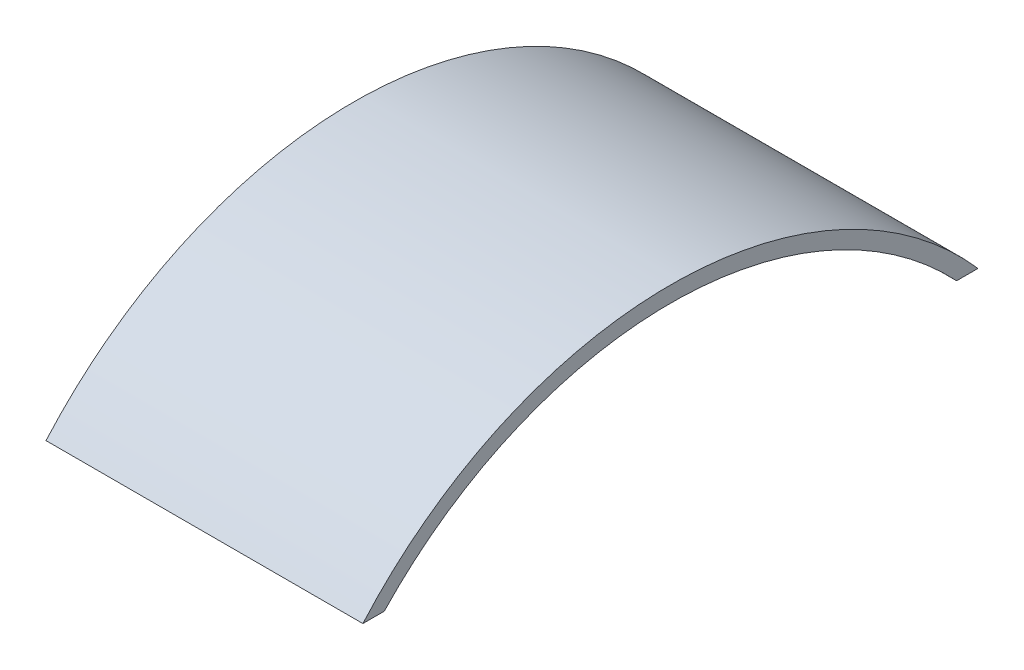
ISO-10303-21;
HEADER;
FILE_DESCRIPTION(('STEP AP214'),'2;1');
FILE_NAME('part.step','',(''),(''),'','','');
FILE_SCHEMA(('AUTOMOTIVE_DESIGN { 1 0 10303 214 1 1 1 1 }'));
ENDSEC;
DATA;
#1=APPLICATION_CONTEXT('core data for automotive mechanical design processes');
#2=APPLICATION_PROTOCOL_DEFINITION('international standard','automotive_design',2000,#1);
#3=PRODUCT_CONTEXT('',#1,'mechanical');
#4=PRODUCT('Part','Part','',(#3));
#5=PRODUCT_RELATED_PRODUCT_CATEGORY('part','',(#4));
#6=PRODUCT_DEFINITION_FORMATION('','',#4);
#7=PRODUCT_DEFINITION_CONTEXT('part definition',#1,'design');
#8=PRODUCT_DEFINITION('design','',#6,#7);
#9=PRODUCT_DEFINITION_SHAPE('','',#8);
#10=(LENGTH_UNIT() NAMED_UNIT(*) SI_UNIT(.MILLI.,.METRE.));
#11=(NAMED_UNIT(*) PLANE_ANGLE_UNIT() SI_UNIT($,.RADIAN.));
#12=(NAMED_UNIT(*) SI_UNIT($,.STERADIAN.) SOLID_ANGLE_UNIT());
#13=UNCERTAINTY_MEASURE_WITH_UNIT(LENGTH_MEASURE(1.E-05),#10,'distance_accuracy_value','');
#14=(GEOMETRIC_REPRESENTATION_CONTEXT(3) GLOBAL_UNCERTAINTY_ASSIGNED_CONTEXT((#13)) GLOBAL_UNIT_ASSIGNED_CONTEXT((#10,
#11,#12)) REPRESENTATION_CONTEXT('',''));
#15=CARTESIAN_POINT('',(0.,0.,0.));
#16=DIRECTION('',(0.,0.,1.));
#17=DIRECTION('',(1.,0.,0.));
#18=AXIS2_PLACEMENT_3D('',#15,#16,#17);
#19=CARTESIAN_POINT('',(2.,0.,0.));
#20=DIRECTION('',(-1.,0.,0.));
#21=DIRECTION('',(0.,0.,1.));
#22=AXIS2_PLACEMENT_3D('',#19,#20,#21);
#23=CYLINDRICAL_SURFACE('',#22,2.48027082337627);
#24=CARTESIAN_POINT('',(0.,0.,0.));
#25=DIRECTION('',(-1.,0.,0.));
#26=DIRECTION('',(0.,0.,-1.));
#27=AXIS2_PLACEMENT_3D('',#24,#25,#26);
#28=CIRCLE('',#27,2.48027082337627);
#29=CARTESIAN_POINT('',(0.,1.7,1.80602972215066));
#30=VERTEX_POINT('',#29);
#31=CARTESIAN_POINT('',(0.,1.7,-1.80602972215066));
#32=VERTEX_POINT('',#31);
#33=EDGE_CURVE('E96',#30,#32,#28,.T.);
#34=ORIENTED_EDGE('',*,*,#33,.T.);
#35=DIRECTION('',(-1.,0.,0.));
#36=VECTOR('',#35,1.);
#37=CARTESIAN_POINT('',(2.,1.7,-1.80602972215066));
#38=LINE('',#37,#36);
#39=CARTESIAN_POINT('',(2.,1.7,-1.80602972215066));
#40=VERTEX_POINT('',#39);
#41=EDGE_CURVE('E11',#40,#32,#38,.T.);
#42=ORIENTED_EDGE('',*,*,#41,.F.);
#43=CARTESIAN_POINT('',(2.,0.,0.));
#44=DIRECTION('',(-1.,0.,0.));
#45=DIRECTION('',(0.,0.,-1.));
#46=AXIS2_PLACEMENT_3D('',#43,#44,#45);
#47=CIRCLE('',#46,2.48027082337627);
#48=CARTESIAN_POINT('',(2.,1.7,1.80602972215066));
#49=VERTEX_POINT('',#48);
#50=EDGE_CURVE('E84',#49,#40,#47,.T.);
#51=ORIENTED_EDGE('',*,*,#50,.F.);
#52=DIRECTION('',(-1.,0.,0.));
#53=VECTOR('',#52,1.);
#54=CARTESIAN_POINT('',(2.,1.7,1.80602972215066));
#55=LINE('',#54,#53);
#56=EDGE_CURVE('E92',#49,#30,#55,.T.);
#57=ORIENTED_EDGE('',*,*,#56,.T.);
#58=EDGE_LOOP('',(#34,#42,#51,#57));
#59=FACE_BOUND('',#58,.T.);
#60=ADVANCED_FACE('F33',(#59),#23,.F.);
#61=CARTESIAN_POINT('',(2.,1.7,-1.80602972215066));
#62=DIRECTION('',(0.,1.,0.));
#63=DIRECTION('',(0.,0.,1.));
#64=AXIS2_PLACEMENT_3D('',#61,#62,#63);
#65=PLANE('',#64);
#66=DIRECTION('',(0.,0.,-1.));
#67=VECTOR('',#66,1.);
#68=CARTESIAN_POINT('',(0.,1.7,-1.80602972215066));
#69=LINE('',#68,#67);
#70=CARTESIAN_POINT('',(0.,1.7,-1.94108153408527));
#71=VERTEX_POINT('',#70);
#72=EDGE_CURVE('E88',#32,#71,#69,.T.);
#73=ORIENTED_EDGE('',*,*,#72,.T.);
#74=DIRECTION('',(-1.,0.,0.));
#75=VECTOR('',#74,1.);
#76=CARTESIAN_POINT('',(2.,1.7,-1.94108153408527));
#77=LINE('',#76,#75);
#78=CARTESIAN_POINT('',(2.,1.7,-1.94108153408527));
#79=VERTEX_POINT('',#78);
#80=EDGE_CURVE('E41',#79,#71,#77,.T.);
#81=ORIENTED_EDGE('',*,*,#80,.F.);
#82=DIRECTION('',(0.,0.,-1.));
#83=VECTOR('',#82,1.);
#84=CARTESIAN_POINT('',(2.,1.7,-1.80602972215066));
#85=LINE('',#84,#83);
#86=EDGE_CURVE('E79',#40,#79,#85,.T.);
#87=ORIENTED_EDGE('',*,*,#86,.F.);
#88=ORIENTED_EDGE('',*,*,#41,.T.);
#89=EDGE_LOOP('',(#73,#81,#87,#88));
#90=FACE_BOUND('',#89,.T.);
#91=ADVANCED_FACE('F87',(#90),#65,.F.);
#92=CARTESIAN_POINT('',(2.,0.,0.));
#93=DIRECTION('',(-1.,0.,0.));
#94=DIRECTION('',(0.,0.,1.));
#95=AXIS2_PLACEMENT_3D('',#92,#93,#94);
#96=CYLINDRICAL_SURFACE('',#95,2.58027082337627);
#97=CARTESIAN_POINT('',(0.,0.,0.));
#98=DIRECTION('',(1.,0.,0.));
#99=DIRECTION('',(0.,0.,-1.));
#100=AXIS2_PLACEMENT_3D('',#97,#98,#99);
#101=CIRCLE('',#100,2.58027082337627);
#102=CARTESIAN_POINT('',(0.,1.7,1.94108153408527));
#103=VERTEX_POINT('',#102);
#104=EDGE_CURVE('E66',#71,#103,#101,.T.);
#105=ORIENTED_EDGE('',*,*,#104,.T.);
#106=DIRECTION('',(-1.,0.,0.));
#107=VECTOR('',#106,1.);
#108=CARTESIAN_POINT('',(2.,1.7,1.94108153408527));
#109=LINE('',#108,#107);
#110=CARTESIAN_POINT('',(2.,1.7,1.94108153408527));
#111=VERTEX_POINT('',#110);
#112=EDGE_CURVE('E89',#111,#103,#109,.T.);
#113=ORIENTED_EDGE('',*,*,#112,.F.);
#114=CARTESIAN_POINT('',(2.,0.,0.));
#115=DIRECTION('',(1.,0.,0.));
#116=DIRECTION('',(0.,0.,-1.));
#117=AXIS2_PLACEMENT_3D('',#114,#115,#116);
#118=CIRCLE('',#117,2.58027082337627);
#119=EDGE_CURVE('E82',#79,#111,#118,.T.);
#120=ORIENTED_EDGE('',*,*,#119,.F.);
#121=ORIENTED_EDGE('',*,*,#80,.T.);
#122=EDGE_LOOP('',(#105,#113,#120,#121));
#123=FACE_BOUND('',#122,.T.);
#124=ADVANCED_FACE('F90',(#123),#96,.T.);
#125=CARTESIAN_POINT('',(2.,1.7,1.80602972215066));
#126=DIRECTION('',(0.,1.,0.));
#127=DIRECTION('',(0.,0.,1.));
#128=AXIS2_PLACEMENT_3D('',#125,#126,#127);
#129=PLANE('',#128);
#130=DIRECTION('',(0.,0.,-1.));
#131=VECTOR('',#130,1.);
#132=CARTESIAN_POINT('',(0.,1.7,1.80602972215066));
#133=LINE('',#132,#131);
#134=EDGE_CURVE('E72',#103,#30,#133,.T.);
#135=ORIENTED_EDGE('',*,*,#134,.T.);
#136=ORIENTED_EDGE('',*,*,#56,.F.);
#137=DIRECTION('',(0.,0.,-1.));
#138=VECTOR('',#137,1.);
#139=CARTESIAN_POINT('',(2.,1.7,1.80602972215066));
#140=LINE('',#139,#138);
#141=EDGE_CURVE('E49',#111,#49,#140,.T.);
#142=ORIENTED_EDGE('',*,*,#141,.F.);
#143=ORIENTED_EDGE('',*,*,#112,.T.);
#144=EDGE_LOOP('',(#135,#136,#142,#143));
#145=FACE_BOUND('',#144,.T.);
#146=ADVANCED_FACE('F103',(#145),#129,.F.);
#147=CARTESIAN_POINT('',(2.,0.,0.));
#148=DIRECTION('',(1.,0.,0.));
#149=DIRECTION('',(0.,0.,-1.));
#150=AXIS2_PLACEMENT_3D('',#147,#148,#149);
#151=PLANE('',#150);
#152=ORIENTED_EDGE('',*,*,#50,.T.);
#153=ORIENTED_EDGE('',*,*,#86,.T.);
#154=ORIENTED_EDGE('',*,*,#119,.T.);
#155=ORIENTED_EDGE('',*,*,#141,.T.);
#156=EDGE_LOOP('',(#152,#153,#154,#155));
#157=FACE_BOUND('',#156,.T.);
#158=ADVANCED_FACE('F80',(#157),#151,.T.);
#159=CARTESIAN_POINT('',(0.,0.,0.));
#160=DIRECTION('',(1.,0.,0.));
#161=DIRECTION('',(0.,0.,-1.));
#162=AXIS2_PLACEMENT_3D('',#159,#160,#161);
#163=PLANE('',#162);
#164=ORIENTED_EDGE('',*,*,#33,.F.);
#165=ORIENTED_EDGE('',*,*,#134,.F.);
#166=ORIENTED_EDGE('',*,*,#104,.F.);
#167=ORIENTED_EDGE('',*,*,#72,.F.);
#168=EDGE_LOOP('',(#164,#165,#166,#167));
#169=FACE_BOUND('',#168,.T.);
#170=ADVANCED_FACE('F106',(#169),#163,.F.);
#171=CLOSED_SHELL('',(#60,#91,#124,#146,#158,#170));
#172=MANIFOLD_SOLID_BREP('B2',#171);
#173=ADVANCED_BREP_SHAPE_REPRESENTATION('',(#18,#172),#14);
#174=SHAPE_DEFINITION_REPRESENTATION(#9,#173);
ENDSEC;
END-ISO-10303-21;
